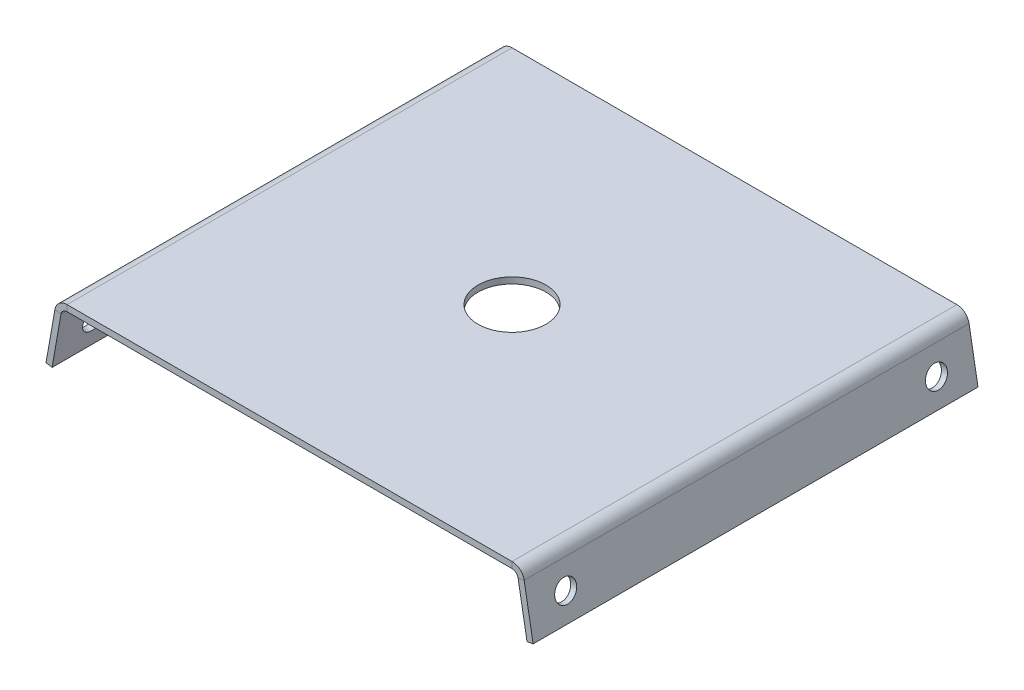
ISO-10303-21;
HEADER;
FILE_DESCRIPTION(('STEP AP214'),'2;1');
FILE_NAME('part.step','',(''),(''),'','','');
FILE_SCHEMA(('AUTOMOTIVE_DESIGN { 1 0 10303 214 1 1 1 1 }'));
ENDSEC;
DATA;
#1=APPLICATION_CONTEXT('core data for automotive mechanical design processes');
#2=APPLICATION_PROTOCOL_DEFINITION('international standard','automotive_design',2000,#1);
#3=PRODUCT_CONTEXT('',#1,'mechanical');
#4=PRODUCT('Part','Part','',(#3));
#5=PRODUCT_RELATED_PRODUCT_CATEGORY('part','',(#4));
#6=PRODUCT_DEFINITION_FORMATION('','',#4);
#7=PRODUCT_DEFINITION_CONTEXT('part definition',#1,'design');
#8=PRODUCT_DEFINITION('design','',#6,#7);
#9=PRODUCT_DEFINITION_SHAPE('','',#8);
#10=(LENGTH_UNIT() NAMED_UNIT(*) SI_UNIT(.MILLI.,.METRE.));
#11=(NAMED_UNIT(*) PLANE_ANGLE_UNIT() SI_UNIT($,.RADIAN.));
#12=(NAMED_UNIT(*) SI_UNIT($,.STERADIAN.) SOLID_ANGLE_UNIT());
#13=UNCERTAINTY_MEASURE_WITH_UNIT(LENGTH_MEASURE(1.E-05),#10,'distance_accuracy_value','');
#14=(GEOMETRIC_REPRESENTATION_CONTEXT(3) GLOBAL_UNCERTAINTY_ASSIGNED_CONTEXT((#13)) GLOBAL_UNIT_ASSIGNED_CONTEXT((#10,
#11,#12)) REPRESENTATION_CONTEXT('',''));
#15=CARTESIAN_POINT('',(0.,0.,0.));
#16=DIRECTION('',(0.,0.,1.));
#17=DIRECTION('',(1.,0.,0.));
#18=AXIS2_PLACEMENT_3D('',#15,#16,#17);
#19=CARTESIAN_POINT('',(-114.3,3.175,114.3));
#20=DIRECTION('',(0.,0.,-1.));
#21=DIRECTION('',(1.,0.,0.));
#22=AXIS2_PLACEMENT_3D('',#19,#20,#21);
#23=PLANE('',#22);
#24=DIRECTION('',(0.,1.,0.));
#25=VECTOR('',#24,1.);
#26=CARTESIAN_POINT('',(-114.3,3.175,114.3));
#27=LINE('',#26,#25);
#28=CARTESIAN_POINT('',(-114.3,0.,114.3));
#29=VERTEX_POINT('',#28);
#30=CARTESIAN_POINT('',(-114.3,3.175,114.3));
#31=VERTEX_POINT('',#30);
#32=EDGE_CURVE('E88',#29,#31,#27,.T.);
#33=ORIENTED_EDGE('',*,*,#32,.F.);
#34=DIRECTION('',(1.,0.,0.));
#35=VECTOR('',#34,1.);
#36=CARTESIAN_POINT('',(0.,0.,114.3));
#37=LINE('',#36,#35);
#38=CARTESIAN_POINT('',(114.3,0.,114.3));
#39=VERTEX_POINT('',#38);
#40=EDGE_CURVE('E281',#29,#39,#37,.T.);
#41=ORIENTED_EDGE('',*,*,#40,.T.);
#42=DIRECTION('',(0.,1.,0.));
#43=VECTOR('',#42,1.);
#44=CARTESIAN_POINT('',(114.3,3.175,114.3));
#45=LINE('',#44,#43);
#46=CARTESIAN_POINT('',(114.3,3.17500000000002,114.3));
#47=VERTEX_POINT('',#46);
#48=EDGE_CURVE('E290',#39,#47,#45,.T.);
#49=ORIENTED_EDGE('',*,*,#48,.T.);
#50=DIRECTION('',(1.,0.,0.));
#51=VECTOR('',#50,1.);
#52=CARTESIAN_POINT('',(-114.3,3.175,114.3));
#53=LINE('',#52,#51);
#54=EDGE_CURVE('E273',#31,#47,#53,.T.);
#55=ORIENTED_EDGE('',*,*,#54,.F.);
#56=EDGE_LOOP('',(#33,#41,#49,#55));
#57=FACE_BOUND('',#56,.T.);
#58=ADVANCED_FACE('F79',(#57),#23,.F.);
#59=CARTESIAN_POINT('',(-114.3,3.175,-114.3));
#60=DIRECTION('',(0.,0.,1.));
#61=DIRECTION('',(-1.,0.,0.));
#62=AXIS2_PLACEMENT_3D('',#59,#60,#61);
#63=PLANE('',#62);
#64=DIRECTION('',(1.,0.,0.));
#65=VECTOR('',#64,1.);
#66=CARTESIAN_POINT('',(0.,0.,-114.3));
#67=LINE('',#66,#65);
#68=CARTESIAN_POINT('',(114.3,0.,-114.3));
#69=VERTEX_POINT('',#68);
#70=CARTESIAN_POINT('',(-114.3,0.,-114.3));
#71=VERTEX_POINT('',#70);
#72=EDGE_CURVE('E280',#69,#71,#67,.F.);
#73=ORIENTED_EDGE('',*,*,#72,.T.);
#74=DIRECTION('',(0.,1.,0.));
#75=VECTOR('',#74,1.);
#76=CARTESIAN_POINT('',(-114.3,3.175,-114.3));
#77=LINE('',#76,#75);
#78=CARTESIAN_POINT('',(-114.3,3.17500000000002,-114.3));
#79=VERTEX_POINT('',#78);
#80=EDGE_CURVE('E13',#71,#79,#77,.T.);
#81=ORIENTED_EDGE('',*,*,#80,.T.);
#82=DIRECTION('',(-1.,0.,0.));
#83=VECTOR('',#82,1.);
#84=CARTESIAN_POINT('',(-114.3,3.175,-114.3));
#85=LINE('',#84,#83);
#86=CARTESIAN_POINT('',(114.3,3.175,-114.3));
#87=VERTEX_POINT('',#86);
#88=EDGE_CURVE('E266',#87,#79,#85,.T.);
#89=ORIENTED_EDGE('',*,*,#88,.F.);
#90=DIRECTION('',(0.,1.,0.));
#91=VECTOR('',#90,1.);
#92=CARTESIAN_POINT('',(114.3,3.175,-114.3));
#93=LINE('',#92,#91);
#94=EDGE_CURVE('E83',#69,#87,#93,.T.);
#95=ORIENTED_EDGE('',*,*,#94,.F.);
#96=EDGE_LOOP('',(#73,#81,#89,#95));
#97=FACE_BOUND('',#96,.T.);
#98=ADVANCED_FACE('F320',(#97),#63,.F.);
#99=CARTESIAN_POINT('',(0.,3.175,0.));
#100=DIRECTION('',(0.,-1.,0.));
#101=DIRECTION('',(0.,0.,-1.));
#102=AXIS2_PLACEMENT_3D('',#99,#100,#101);
#103=CYLINDRICAL_SURFACE('',#102,17.4625);
#104=CARTESIAN_POINT('',(0.,3.175,0.));
#105=DIRECTION('',(0.,1.,0.));
#106=DIRECTION('',(0.,0.,1.));
#107=AXIS2_PLACEMENT_3D('',#104,#105,#106);
#108=CIRCLE('',#107,17.4625);
#109=CARTESIAN_POINT('',(0.,3.175,17.4625));
#110=VERTEX_POINT('',#109);
#111=EDGE_CURVE('E276',#110,#110,#108,.T.);
#112=ORIENTED_EDGE('',*,*,#111,.T.);
#113=EDGE_LOOP('',(#112));
#114=FACE_BOUND('',#113,.T.);
#115=CARTESIAN_POINT('',(0.,0.,0.));
#116=DIRECTION('',(0.,1.,0.));
#117=DIRECTION('',(0.,0.,1.));
#118=AXIS2_PLACEMENT_3D('',#115,#116,#117);
#119=CIRCLE('',#118,17.4625);
#120=CARTESIAN_POINT('',(0.,0.,17.4625));
#121=VERTEX_POINT('',#120);
#122=EDGE_CURVE('E267',#121,#121,#119,.T.);
#123=ORIENTED_EDGE('',*,*,#122,.F.);
#124=EDGE_LOOP('',(#123));
#125=FACE_BOUND('',#124,.T.);
#126=ADVANCED_FACE('F81',(#114,#125),#103,.F.);
#127=CARTESIAN_POINT('',(0.,3.175,0.));
#128=DIRECTION('',(0.,-1.,0.));
#129=DIRECTION('',(0.,0.,-1.));
#130=AXIS2_PLACEMENT_3D('',#127,#128,#129);
#131=PLANE('',#130);
#132=DIRECTION('',(0.,0.,-1.));
#133=VECTOR('',#132,1.);
#134=CARTESIAN_POINT('',(114.3,3.175,114.3));
#135=LINE('',#134,#133);
#136=EDGE_CURVE('E263',#47,#87,#135,.T.);
#137=ORIENTED_EDGE('',*,*,#136,.T.);
#138=ORIENTED_EDGE('',*,*,#88,.T.);
#139=DIRECTION('',(0.,0.,1.));
#140=VECTOR('',#139,1.);
#141=CARTESIAN_POINT('',(-114.3,3.175,114.3));
#142=LINE('',#141,#140);
#143=EDGE_CURVE('E270',#79,#31,#142,.T.);
#144=ORIENTED_EDGE('',*,*,#143,.T.);
#145=ORIENTED_EDGE('',*,*,#54,.T.);
#146=EDGE_LOOP('',(#137,#138,#144,#145));
#147=FACE_BOUND('',#146,.T.);
#148=ORIENTED_EDGE('',*,*,#111,.F.);
#149=EDGE_LOOP('',(#148));
#150=FACE_BOUND('',#149,.T.);
#151=ADVANCED_FACE('F301',(#147,#150),#131,.F.);
#152=CARTESIAN_POINT('',(0.,0.,0.));
#153=DIRECTION('',(0.,-1.,0.));
#154=DIRECTION('',(0.,0.,-1.));
#155=AXIS2_PLACEMENT_3D('',#152,#153,#154);
#156=PLANE('',#155);
#157=DIRECTION('',(0.,0.,-1.));
#158=VECTOR('',#157,1.);
#159=CARTESIAN_POINT('',(114.3,0.,0.));
#160=LINE('',#159,#158);
#161=EDGE_CURVE('E254',#39,#69,#160,.T.);
#162=ORIENTED_EDGE('',*,*,#161,.F.);
#163=ORIENTED_EDGE('',*,*,#40,.F.);
#164=DIRECTION('',(0.,0.,-1.));
#165=VECTOR('',#164,1.);
#166=CARTESIAN_POINT('',(-114.3,0.,0.));
#167=LINE('',#166,#165);
#168=EDGE_CURVE('E284',#71,#29,#167,.F.);
#169=ORIENTED_EDGE('',*,*,#168,.F.);
#170=ORIENTED_EDGE('',*,*,#72,.F.);
#171=EDGE_LOOP('',(#162,#163,#169,#170));
#172=FACE_BOUND('',#171,.T.);
#173=ORIENTED_EDGE('',*,*,#122,.T.);
#174=EDGE_LOOP('',(#173));
#175=FACE_BOUND('',#174,.T.);
#176=ADVANCED_FACE('F315',(#172,#175),#156,.T.);
#177=CARTESIAN_POINT('',(114.3,-3.17500000000001,-114.3));
#178=DIRECTION('',(0.,0.,-1.));
#179=DIRECTION('',(-1.,0.,0.));
#180=AXIS2_PLACEMENT_3D('',#177,#178,#179);
#181=PLANE('',#180);
#182=DIRECTION('',(-0.984807753012208,-0.173648177666934,0.));
#183=VECTOR('',#182,1.);
#184=CARTESIAN_POINT('',(120.553529231628,-2.07233407181498,-114.3));
#185=LINE('',#184,#183);
#186=CARTESIAN_POINT('',(117.426764615814,-2.62366703590749,-114.3));
#187=VERTEX_POINT('',#186);
#188=CARTESIAN_POINT('',(120.553529231628,-2.07233407181498,-114.3));
#189=VERTEX_POINT('',#188);
#190=EDGE_CURVE('E213',#187,#189,#185,.F.);
#191=ORIENTED_EDGE('',*,*,#190,.F.);
#192=CARTESIAN_POINT('',(114.3,-3.17500000000001,-114.3));
#193=DIRECTION('',(0.,0.,1.));
#194=DIRECTION('',(1.,0.,0.));
#195=AXIS2_PLACEMENT_3D('',#192,#193,#194);
#196=CIRCLE('',#195,3.17500000000003);
#197=EDGE_CURVE('E258',#69,#187,#196,.F.);
#198=ORIENTED_EDGE('',*,*,#197,.F.);
#199=ORIENTED_EDGE('',*,*,#94,.T.);
#200=CARTESIAN_POINT('',(114.3,-3.17500000000001,-114.3));
#201=DIRECTION('',(0.,0.,1.));
#202=DIRECTION('',(1.,0.,0.));
#203=AXIS2_PLACEMENT_3D('',#200,#201,#202);
#204=CIRCLE('',#203,6.35000000000003);
#205=EDGE_CURVE('E103',#87,#189,#204,.F.);
#206=ORIENTED_EDGE('',*,*,#205,.T.);
#207=EDGE_LOOP('',(#191,#198,#199,#206));
#208=FACE_BOUND('',#207,.T.);
#209=ADVANCED_FACE('F322',(#208),#181,.T.);
#210=CARTESIAN_POINT('',(114.3,-3.17500000000001,114.3));
#211=DIRECTION('',(0.,0.,-1.));
#212=DIRECTION('',(-1.,0.,0.));
#213=AXIS2_PLACEMENT_3D('',#210,#211,#212);
#214=PLANE('',#213);
#215=CARTESIAN_POINT('',(114.3,-3.17500000000001,114.3));
#216=DIRECTION('',(0.,0.,1.));
#217=DIRECTION('',(1.,0.,0.));
#218=AXIS2_PLACEMENT_3D('',#215,#216,#217);
#219=CIRCLE('',#218,3.17500000000003);
#220=CARTESIAN_POINT('',(117.426764615814,-2.62366703590749,114.3));
#221=VERTEX_POINT('',#220);
#222=EDGE_CURVE('E226',#221,#39,#219,.T.);
#223=ORIENTED_EDGE('',*,*,#222,.F.);
#224=DIRECTION('',(-0.984807753012208,-0.173648177666934,0.));
#225=VECTOR('',#224,1.);
#226=CARTESIAN_POINT('',(117.426764615814,-2.6236670359075,114.3));
#227=LINE('',#226,#225);
#228=CARTESIAN_POINT('',(120.553529231628,-2.07233407181498,114.3));
#229=VERTEX_POINT('',#228);
#230=EDGE_CURVE('E246',#221,#229,#227,.F.);
#231=ORIENTED_EDGE('',*,*,#230,.T.);
#232=CARTESIAN_POINT('',(114.3,-3.17500000000001,114.3));
#233=DIRECTION('',(0.,0.,1.));
#234=DIRECTION('',(1.,0.,0.));
#235=AXIS2_PLACEMENT_3D('',#232,#233,#234);
#236=CIRCLE('',#235,6.35000000000003);
#237=EDGE_CURVE('E255',#229,#47,#236,.T.);
#238=ORIENTED_EDGE('',*,*,#237,.T.);
#239=ORIENTED_EDGE('',*,*,#48,.F.);
#240=EDGE_LOOP('',(#223,#231,#238,#239));
#241=FACE_BOUND('',#240,.T.);
#242=ADVANCED_FACE('F306',(#241),#214,.F.);
#243=CARTESIAN_POINT('',(114.3,-3.17500000000001,114.3));
#244=DIRECTION('',(0.,0.,1.));
#245=DIRECTION('',(0.984807753012208,0.173648177666934,0.));
#246=AXIS2_PLACEMENT_3D('',#243,#244,#245);
#247=CYLINDRICAL_SURFACE('',#246,6.35000000000003);
#248=ORIENTED_EDGE('',*,*,#136,.F.);
#249=ORIENTED_EDGE('',*,*,#237,.F.);
#250=DIRECTION('',(0.,0.,1.));
#251=VECTOR('',#250,1.);
#252=CARTESIAN_POINT('',(120.553529231628,-2.07233407181497,-114.3));
#253=LINE('',#252,#251);
#254=EDGE_CURVE('E244',#229,#189,#253,.F.);
#255=ORIENTED_EDGE('',*,*,#254,.T.);
#256=ORIENTED_EDGE('',*,*,#205,.F.);
#257=EDGE_LOOP('',(#248,#249,#255,#256));
#258=FACE_BOUND('',#257,.T.);
#259=ADVANCED_FACE('F323',(#258),#247,.T.);
#260=CARTESIAN_POINT('',(114.3,-3.17500000000001,114.3));
#261=DIRECTION('',(0.,0.,1.));
#262=DIRECTION('',(0.984807753012208,0.173648177666934,0.));
#263=AXIS2_PLACEMENT_3D('',#260,#261,#262);
#264=CYLINDRICAL_SURFACE('',#263,3.17500000000003);
#265=ORIENTED_EDGE('',*,*,#161,.T.);
#266=ORIENTED_EDGE('',*,*,#197,.T.);
#267=DIRECTION('',(0.,0.,1.));
#268=VECTOR('',#267,1.);
#269=CARTESIAN_POINT('',(117.426764615814,-2.6236670359075,-114.3));
#270=LINE('',#269,#268);
#271=EDGE_CURVE('E249',#187,#221,#270,.T.);
#272=ORIENTED_EDGE('',*,*,#271,.T.);
#273=ORIENTED_EDGE('',*,*,#222,.T.);
#274=EDGE_LOOP('',(#265,#266,#272,#273));
#275=FACE_BOUND('',#274,.T.);
#276=ADVANCED_FACE('F310',(#275),#264,.F.);
#277=CARTESIAN_POINT('',(125.141612298901,-28.0926461581376,114.3));
#278=DIRECTION('',(0.,0.,-1.));
#279=DIRECTION('',(-1.,0.,0.));
#280=AXIS2_PLACEMENT_3D('',#277,#278,#279);
#281=PLANE('',#280);
#282=ORIENTED_EDGE('',*,*,#230,.F.);
#283=DIRECTION('',(-0.173648177666934,0.984807753012207,0.));
#284=VECTOR('',#283,1.);
#285=CARTESIAN_POINT('',(122.014847683087,-28.6439791222301,114.3));
#286=LINE('',#285,#284);
#287=CARTESIAN_POINT('',(122.014847683087,-28.6439791222301,114.3));
#288=VERTEX_POINT('',#287);
#289=EDGE_CURVE('E242',#221,#288,#286,.F.);
#290=ORIENTED_EDGE('',*,*,#289,.T.);
#291=DIRECTION('',(-0.984807753012208,-0.173648177666934,0.));
#292=VECTOR('',#291,1.);
#293=CARTESIAN_POINT('',(125.141612298901,-28.0926461581376,114.3));
#294=LINE('',#293,#292);
#295=CARTESIAN_POINT('',(125.141612298901,-28.0926461581376,114.3));
#296=VERTEX_POINT('',#295);
#297=EDGE_CURVE('E223',#296,#288,#294,.T.);
#298=ORIENTED_EDGE('',*,*,#297,.F.);
#299=DIRECTION('',(0.173648177666934,-0.984807753012207,0.));
#300=VECTOR('',#299,1.);
#301=CARTESIAN_POINT('',(116.644339222716,20.0977841551549,114.3));
#302=LINE('',#301,#300);
#303=EDGE_CURVE('E235',#229,#296,#302,.T.);
#304=ORIENTED_EDGE('',*,*,#303,.F.);
#305=EDGE_LOOP('',(#282,#290,#298,#304));
#306=FACE_BOUND('',#305,.T.);
#307=ADVANCED_FACE('F333',(#306),#281,.F.);
#308=CARTESIAN_POINT('',(120.090905944802,0.551332964092513,-114.3));
#309=DIRECTION('',(0.,0.,1.));
#310=DIRECTION('',(1.,0.,0.));
#311=AXIS2_PLACEMENT_3D('',#308,#309,#310);
#312=PLANE('',#311);
#313=ORIENTED_EDGE('',*,*,#190,.T.);
#314=DIRECTION('',(-0.173648177666934,0.984807753012207,0.));
#315=VECTOR('',#314,1.);
#316=CARTESIAN_POINT('',(116.644339222716,20.0977841551549,-114.3));
#317=LINE('',#316,#315);
#318=CARTESIAN_POINT('',(125.141612298901,-28.0926461581376,-114.3));
#319=VERTEX_POINT('',#318);
#320=EDGE_CURVE('E230',#319,#189,#317,.T.);
#321=ORIENTED_EDGE('',*,*,#320,.F.);
#322=DIRECTION('',(-0.984807753012208,-0.173648177666934,0.));
#323=VECTOR('',#322,1.);
#324=CARTESIAN_POINT('',(125.141612298901,-28.0926461581376,-114.3));
#325=LINE('',#324,#323);
#326=CARTESIAN_POINT('',(122.014847683087,-28.6439791222301,-114.3));
#327=VERTEX_POINT('',#326);
#328=EDGE_CURVE('E227',#319,#327,#325,.T.);
#329=ORIENTED_EDGE('',*,*,#328,.T.);
#330=DIRECTION('',(0.173648177666934,-0.984807753012207,0.));
#331=VECTOR('',#330,1.);
#332=CARTESIAN_POINT('',(116.964141328988,0.,-114.3));
#333=LINE('',#332,#331);
#334=EDGE_CURVE('E237',#327,#187,#333,.F.);
#335=ORIENTED_EDGE('',*,*,#334,.T.);
#336=EDGE_LOOP('',(#313,#321,#329,#335));
#337=FACE_BOUND('',#336,.T.);
#338=ADVANCED_FACE('F340',(#337),#312,.F.);
#339=CARTESIAN_POINT('',(116.644339222716,20.0977841551549,0.));
#340=DIRECTION('',(-0.984807753012208,-0.173648177666934,0.));
#341=DIRECTION('',(0.173648177666934,-0.984807753012208,0.));
#342=AXIS2_PLACEMENT_3D('',#339,#340,#341);
#343=PLANE('',#342);
#344=CARTESIAN_POINT('',(122.847570765264,-15.0824901149763,95.25));
#345=DIRECTION('',(0.984807753012207,0.173648177666934,0.));
#346=DIRECTION('',(-0.173648177666934,0.984807753012207,0.));
#347=AXIS2_PLACEMENT_3D('',#344,#345,#346);
#348=CIRCLE('',#347,5.58799999999999);
#349=CARTESIAN_POINT('',(121.877224748461,-9.57938439114406,95.25));
#350=VERTEX_POINT('',#349);
#351=EDGE_CURVE('E500',#350,#350,#348,.T.);
#352=ORIENTED_EDGE('',*,*,#351,.F.);
#353=EDGE_LOOP('',(#352));
#354=FACE_BOUND('',#353,.T.);
#355=CARTESIAN_POINT('',(122.847570765264,-15.0824901149763,-95.25));
#356=DIRECTION('',(0.984807753012207,0.173648177666934,0.));
#357=DIRECTION('',(-0.173648177666934,0.984807753012207,0.));
#358=AXIS2_PLACEMENT_3D('',#355,#356,#357);
#359=CIRCLE('',#358,5.58799999999999);
#360=CARTESIAN_POINT('',(121.877224748461,-9.57938439114406,-95.25));
#361=VERTEX_POINT('',#360);
#362=EDGE_CURVE('E493',#361,#361,#359,.T.);
#363=ORIENTED_EDGE('',*,*,#362,.F.);
#364=EDGE_LOOP('',(#363));
#365=FACE_BOUND('',#364,.T.);
#366=ORIENTED_EDGE('',*,*,#254,.F.);
#367=ORIENTED_EDGE('',*,*,#303,.T.);
#368=DIRECTION('',(0.,0.,-1.));
#369=VECTOR('',#368,1.);
#370=CARTESIAN_POINT('',(125.141612298901,-28.0926461581376,0.));
#371=LINE('',#370,#369);
#372=EDGE_CURVE('E233',#296,#319,#371,.T.);
#373=ORIENTED_EDGE('',*,*,#372,.T.);
#374=ORIENTED_EDGE('',*,*,#320,.T.);
#375=EDGE_LOOP('',(#366,#367,#373,#374));
#376=FACE_BOUND('',#375,.T.);
#377=ADVANCED_FACE('F329',(#354,#365,#376),#343,.F.);
#378=CARTESIAN_POINT('',(113.517574606902,19.5464511910624,0.));
#379=DIRECTION('',(-0.984807753012208,-0.173648177666934,0.));
#380=DIRECTION('',(0.173648177666934,-0.984807753012208,0.));
#381=AXIS2_PLACEMENT_3D('',#378,#379,#380);
#382=PLANE('',#381);
#383=CARTESIAN_POINT('',(119.720806149451,-15.6338230790688,95.25));
#384=DIRECTION('',(0.984807753012207,0.173648177666934,0.));
#385=DIRECTION('',(-0.173648177666934,0.984807753012207,0.));
#386=AXIS2_PLACEMENT_3D('',#383,#384,#385);
#387=CIRCLE('',#386,5.58799999999999);
#388=CARTESIAN_POINT('',(118.750460132648,-10.1307173552366,95.25));
#389=VERTEX_POINT('',#388);
#390=EDGE_CURVE('E211',#389,#389,#387,.T.);
#391=ORIENTED_EDGE('',*,*,#390,.T.);
#392=EDGE_LOOP('',(#391));
#393=FACE_BOUND('',#392,.T.);
#394=CARTESIAN_POINT('',(119.720806149451,-15.6338230790688,-95.25));
#395=DIRECTION('',(0.984807753012207,0.173648177666934,0.));
#396=DIRECTION('',(-0.173648177666934,0.984807753012207,0.));
#397=AXIS2_PLACEMENT_3D('',#394,#395,#396);
#398=CIRCLE('',#397,5.58799999999999);
#399=CARTESIAN_POINT('',(118.750460132648,-10.1307173552366,-95.25));
#400=VERTEX_POINT('',#399);
#401=EDGE_CURVE('E496',#400,#400,#398,.T.);
#402=ORIENTED_EDGE('',*,*,#401,.T.);
#403=EDGE_LOOP('',(#402));
#404=FACE_BOUND('',#403,.T.);
#405=ORIENTED_EDGE('',*,*,#289,.F.);
#406=ORIENTED_EDGE('',*,*,#271,.F.);
#407=ORIENTED_EDGE('',*,*,#334,.F.);
#408=DIRECTION('',(0.,0.,1.));
#409=VECTOR('',#408,1.);
#410=CARTESIAN_POINT('',(122.014847683087,-28.6439791222301,-114.3));
#411=LINE('',#410,#409);
#412=EDGE_CURVE('E240',#288,#327,#411,.F.);
#413=ORIENTED_EDGE('',*,*,#412,.F.);
#414=EDGE_LOOP('',(#405,#406,#407,#413));
#415=FACE_BOUND('',#414,.T.);
#416=ADVANCED_FACE('F342',(#393,#404,#415),#382,.T.);
#417=CARTESIAN_POINT('',(125.141612298901,-28.0926461581376,-114.3));
#418=DIRECTION('',(-0.173648177666934,0.984807753012207,0.));
#419=DIRECTION('',(-0.984807753012207,-0.173648177666934,0.));
#420=AXIS2_PLACEMENT_3D('',#417,#418,#419);
#421=PLANE('',#420);
#422=ORIENTED_EDGE('',*,*,#412,.T.);
#423=ORIENTED_EDGE('',*,*,#328,.F.);
#424=ORIENTED_EDGE('',*,*,#372,.F.);
#425=ORIENTED_EDGE('',*,*,#297,.T.);
#426=EDGE_LOOP('',(#422,#423,#424,#425));
#427=FACE_BOUND('',#426,.T.);
#428=ADVANCED_FACE('F336',(#427),#421,.F.);
#429=CARTESIAN_POINT('',(-114.3,-3.17500000000001,114.3));
#430=DIRECTION('',(0.,0.,1.));
#431=DIRECTION('',(1.,0.,0.));
#432=AXIS2_PLACEMENT_3D('',#429,#430,#431);
#433=PLANE('',#432);
#434=DIRECTION('',(0.984807753012208,-0.173648177666934,0.));
#435=VECTOR('',#434,1.);
#436=CARTESIAN_POINT('',(-120.553529231628,-2.07233407181498,114.3));
#437=LINE('',#436,#435);
#438=CARTESIAN_POINT('',(-117.426764615814,-2.62366703590749,114.3));
#439=VERTEX_POINT('',#438);
#440=CARTESIAN_POINT('',(-120.553529231628,-2.07233407181498,114.3));
#441=VERTEX_POINT('',#440);
#442=EDGE_CURVE('E193',#439,#441,#437,.F.);
#443=ORIENTED_EDGE('',*,*,#442,.F.);
#444=CARTESIAN_POINT('',(-114.3,-3.17500000000001,114.3));
#445=DIRECTION('',(0.,0.,-1.));
#446=DIRECTION('',(-1.,0.,0.));
#447=AXIS2_PLACEMENT_3D('',#444,#445,#446);
#448=CIRCLE('',#447,3.17500000000003);
#449=EDGE_CURVE('E217',#29,#439,#448,.F.);
#450=ORIENTED_EDGE('',*,*,#449,.F.);
#451=ORIENTED_EDGE('',*,*,#32,.T.);
#452=CARTESIAN_POINT('',(-114.3,-3.17500000000001,114.3));
#453=DIRECTION('',(0.,0.,-1.));
#454=DIRECTION('',(-1.,0.,0.));
#455=AXIS2_PLACEMENT_3D('',#452,#453,#454);
#456=CIRCLE('',#455,6.35000000000003);
#457=EDGE_CURVE('E95',#31,#441,#456,.F.);
#458=ORIENTED_EDGE('',*,*,#457,.T.);
#459=EDGE_LOOP('',(#443,#450,#451,#458));
#460=FACE_BOUND('',#459,.T.);
#461=ADVANCED_FACE('F296',(#460),#433,.T.);
#462=CARTESIAN_POINT('',(-114.3,-3.17500000000001,-114.3));
#463=DIRECTION('',(0.,0.,1.));
#464=DIRECTION('',(1.,0.,0.));
#465=AXIS2_PLACEMENT_3D('',#462,#463,#464);
#466=PLANE('',#465);
#467=CARTESIAN_POINT('',(-114.3,-3.17500000000001,-114.3));
#468=DIRECTION('',(0.,0.,-1.));
#469=DIRECTION('',(-1.,0.,0.));
#470=AXIS2_PLACEMENT_3D('',#467,#468,#469);
#471=CIRCLE('',#470,3.17500000000003);
#472=CARTESIAN_POINT('',(-117.426764615814,-2.62366703590749,-114.3));
#473=VERTEX_POINT('',#472);
#474=EDGE_CURVE('E220',#473,#71,#471,.T.);
#475=ORIENTED_EDGE('',*,*,#474,.F.);
#476=DIRECTION('',(0.984807753012208,-0.173648177666934,0.));
#477=VECTOR('',#476,1.);
#478=CARTESIAN_POINT('',(-117.426764615814,-2.6236670359075,-114.3));
#479=LINE('',#478,#477);
#480=CARTESIAN_POINT('',(-120.553529231628,-2.07233407181498,-114.3));
#481=VERTEX_POINT('',#480);
#482=EDGE_CURVE('E205',#473,#481,#479,.F.);
#483=ORIENTED_EDGE('',*,*,#482,.T.);
#484=CARTESIAN_POINT('',(-114.3,-3.17500000000001,-114.3));
#485=DIRECTION('',(0.,0.,-1.));
#486=DIRECTION('',(-1.,0.,0.));
#487=AXIS2_PLACEMENT_3D('',#484,#485,#486);
#488=CIRCLE('',#487,6.35000000000003);
#489=EDGE_CURVE('E214',#481,#79,#488,.T.);
#490=ORIENTED_EDGE('',*,*,#489,.T.);
#491=ORIENTED_EDGE('',*,*,#80,.F.);
#492=EDGE_LOOP('',(#475,#483,#490,#491));
#493=FACE_BOUND('',#492,.T.);
#494=ADVANCED_FACE('F477',(#493),#466,.F.);
#495=CARTESIAN_POINT('',(-114.3,-3.17500000000001,-114.3));
#496=DIRECTION('',(0.,0.,-1.));
#497=DIRECTION('',(-0.984807753012208,0.173648177666934,0.));
#498=AXIS2_PLACEMENT_3D('',#495,#496,#497);
#499=CYLINDRICAL_SURFACE('',#498,6.35000000000003);
#500=ORIENTED_EDGE('',*,*,#143,.F.);
#501=ORIENTED_EDGE('',*,*,#489,.F.);
#502=DIRECTION('',(0.,0.,-1.));
#503=VECTOR('',#502,1.);
#504=CARTESIAN_POINT('',(-120.553529231628,-2.07233407181497,114.3));
#505=LINE('',#504,#503);
#506=EDGE_CURVE('E203',#481,#441,#505,.F.);
#507=ORIENTED_EDGE('',*,*,#506,.T.);
#508=ORIENTED_EDGE('',*,*,#457,.F.);
#509=EDGE_LOOP('',(#500,#501,#507,#508));
#510=FACE_BOUND('',#509,.T.);
#511=ADVANCED_FACE('F474',(#510),#499,.T.);
#512=CARTESIAN_POINT('',(-114.3,-3.17500000000001,-114.3));
#513=DIRECTION('',(0.,0.,-1.));
#514=DIRECTION('',(-0.984807753012208,0.173648177666934,0.));
#515=AXIS2_PLACEMENT_3D('',#512,#513,#514);
#516=CYLINDRICAL_SURFACE('',#515,3.17500000000003);
#517=ORIENTED_EDGE('',*,*,#168,.T.);
#518=ORIENTED_EDGE('',*,*,#449,.T.);
#519=DIRECTION('',(0.,0.,-1.));
#520=VECTOR('',#519,1.);
#521=CARTESIAN_POINT('',(-117.426764615814,-2.6236670359075,114.3));
#522=LINE('',#521,#520);
#523=EDGE_CURVE('E208',#439,#473,#522,.T.);
#524=ORIENTED_EDGE('',*,*,#523,.T.);
#525=ORIENTED_EDGE('',*,*,#474,.T.);
#526=EDGE_LOOP('',(#517,#518,#524,#525));
#527=FACE_BOUND('',#526,.T.);
#528=ADVANCED_FACE('F472',(#527),#516,.F.);
#529=CARTESIAN_POINT('',(-125.141612298901,-28.0926461581376,-114.3));
#530=DIRECTION('',(0.,0.,1.));
#531=DIRECTION('',(1.,0.,0.));
#532=AXIS2_PLACEMENT_3D('',#529,#530,#531);
#533=PLANE('',#532);
#534=ORIENTED_EDGE('',*,*,#482,.F.);
#535=DIRECTION('',(0.173648177666934,0.984807753012207,0.));
#536=VECTOR('',#535,1.);
#537=CARTESIAN_POINT('',(-122.014847683087,-28.6439791222301,-114.3));
#538=LINE('',#537,#536);
#539=CARTESIAN_POINT('',(-122.014847683087,-28.6439791222301,-114.3));
#540=VERTEX_POINT('',#539);
#541=EDGE_CURVE('E201',#473,#540,#538,.F.);
#542=ORIENTED_EDGE('',*,*,#541,.T.);
#543=DIRECTION('',(0.984807753012208,-0.173648177666934,0.));
#544=VECTOR('',#543,1.);
#545=CARTESIAN_POINT('',(-125.141612298901,-28.0926461581376,-114.3));
#546=LINE('',#545,#544);
#547=CARTESIAN_POINT('',(-125.141612298901,-28.0926461581376,-114.3));
#548=VERTEX_POINT('',#547);
#549=EDGE_CURVE('E189',#548,#540,#546,.T.);
#550=ORIENTED_EDGE('',*,*,#549,.F.);
#551=DIRECTION('',(-0.173648177666934,-0.984807753012207,0.));
#552=VECTOR('',#551,1.);
#553=CARTESIAN_POINT('',(-116.644339222716,20.0977841551549,-114.3));
#554=LINE('',#553,#552);
#555=EDGE_CURVE('E176',#481,#548,#554,.T.);
#556=ORIENTED_EDGE('',*,*,#555,.F.);
#557=EDGE_LOOP('',(#534,#542,#550,#556));
#558=FACE_BOUND('',#557,.T.);
#559=ADVANCED_FACE('F468',(#558),#533,.F.);
#560=CARTESIAN_POINT('',(-120.090905944802,0.551332964092513,114.3));
#561=DIRECTION('',(0.,0.,-1.));
#562=DIRECTION('',(-1.,0.,0.));
#563=AXIS2_PLACEMENT_3D('',#560,#561,#562);
#564=PLANE('',#563);
#565=ORIENTED_EDGE('',*,*,#442,.T.);
#566=DIRECTION('',(0.173648177666934,0.984807753012207,0.));
#567=VECTOR('',#566,1.);
#568=CARTESIAN_POINT('',(-116.644339222716,20.0977841551549,114.3));
#569=LINE('',#568,#567);
#570=CARTESIAN_POINT('',(-125.141612298901,-28.0926461581376,114.3));
#571=VERTEX_POINT('',#570);
#572=EDGE_CURVE('E174',#571,#441,#569,.T.);
#573=ORIENTED_EDGE('',*,*,#572,.F.);
#574=DIRECTION('',(0.984807753012208,-0.173648177666934,0.));
#575=VECTOR('',#574,1.);
#576=CARTESIAN_POINT('',(-125.141612298901,-28.0926461581376,114.3));
#577=LINE('',#576,#575);
#578=CARTESIAN_POINT('',(-122.014847683087,-28.6439791222301,114.3));
#579=VERTEX_POINT('',#578);
#580=EDGE_CURVE('E182',#571,#579,#577,.T.);
#581=ORIENTED_EDGE('',*,*,#580,.T.);
#582=DIRECTION('',(-0.173648177666934,-0.984807753012207,0.));
#583=VECTOR('',#582,1.);
#584=CARTESIAN_POINT('',(-116.964141328988,0.,114.3));
#585=LINE('',#584,#583);
#586=EDGE_CURVE('E198',#579,#439,#585,.F.);
#587=ORIENTED_EDGE('',*,*,#586,.T.);
#588=EDGE_LOOP('',(#565,#573,#581,#587));
#589=FACE_BOUND('',#588,.T.);
#590=ADVANCED_FACE('F192',(#589),#564,.F.);
#591=CARTESIAN_POINT('',(-116.644339222716,20.0977841551549,0.));
#592=DIRECTION('',(0.984807753012208,-0.173648177666934,0.));
#593=DIRECTION('',(0.173648177666934,0.984807753012208,0.));
#594=AXIS2_PLACEMENT_3D('',#591,#592,#593);
#595=PLANE('',#594);
#596=CARTESIAN_POINT('',(-122.847570765264,-15.0824901149763,95.25));
#597=DIRECTION('',(0.984807753012207,-0.173648177666934,0.));
#598=DIRECTION('',(0.173648177666934,0.984807753012207,0.));
#599=AXIS2_PLACEMENT_3D('',#596,#597,#598);
#600=CIRCLE('',#599,5.58799999999999);
#601=CARTESIAN_POINT('',(-121.877224748461,-9.57938439114406,95.25));
#602=VERTEX_POINT('',#601);
#603=EDGE_CURVE('E510',#602,#602,#600,.T.);
#604=ORIENTED_EDGE('',*,*,#603,.T.);
#605=EDGE_LOOP('',(#604));
#606=FACE_BOUND('',#605,.T.);
#607=CARTESIAN_POINT('',(-122.847570765264,-15.0824901149763,-95.25));
#608=DIRECTION('',(0.984807753012207,-0.173648177666934,0.));
#609=DIRECTION('',(0.173648177666934,0.984807753012207,0.));
#610=AXIS2_PLACEMENT_3D('',#607,#608,#609);
#611=CIRCLE('',#610,5.58799999999999);
#612=CARTESIAN_POINT('',(-121.877224748461,-9.57938439114406,-95.25));
#613=VERTEX_POINT('',#612);
#614=EDGE_CURVE('E504',#613,#613,#611,.T.);
#615=ORIENTED_EDGE('',*,*,#614,.T.);
#616=EDGE_LOOP('',(#615));
#617=FACE_BOUND('',#616,.T.);
#618=ORIENTED_EDGE('',*,*,#506,.F.);
#619=ORIENTED_EDGE('',*,*,#555,.T.);
#620=DIRECTION('',(0.,0.,1.));
#621=VECTOR('',#620,1.);
#622=CARTESIAN_POINT('',(-125.141612298901,-28.0926461581376,0.));
#623=LINE('',#622,#621);
#624=EDGE_CURVE('E169',#548,#571,#623,.T.);
#625=ORIENTED_EDGE('',*,*,#624,.T.);
#626=ORIENTED_EDGE('',*,*,#572,.T.);
#627=EDGE_LOOP('',(#618,#619,#625,#626));
#628=FACE_BOUND('',#627,.T.);
#629=ADVANCED_FACE('F172',(#606,#617,#628),#595,.F.);
#630=CARTESIAN_POINT('',(-113.517574606902,19.5464511910624,0.));
#631=DIRECTION('',(0.984807753012208,-0.173648177666934,0.));
#632=DIRECTION('',(0.173648177666934,0.984807753012208,0.));
#633=AXIS2_PLACEMENT_3D('',#630,#631,#632);
#634=PLANE('',#633);
#635=CARTESIAN_POINT('',(-119.720806149451,-15.6338230790688,95.25));
#636=DIRECTION('',(0.984807753012207,-0.173648177666934,0.));
#637=DIRECTION('',(0.173648177666934,0.984807753012207,0.));
#638=AXIS2_PLACEMENT_3D('',#635,#636,#637);
#639=CIRCLE('',#638,5.58799999999999);
#640=CARTESIAN_POINT('',(-118.750460132648,-10.1307173552366,95.25));
#641=VERTEX_POINT('',#640);
#642=EDGE_CURVE('E497',#641,#641,#639,.T.);
#643=ORIENTED_EDGE('',*,*,#642,.F.);
#644=EDGE_LOOP('',(#643));
#645=FACE_BOUND('',#644,.T.);
#646=CARTESIAN_POINT('',(-119.720806149451,-15.6338230790688,-95.25));
#647=DIRECTION('',(0.984807753012207,-0.173648177666934,0.));
#648=DIRECTION('',(0.173648177666934,0.984807753012207,0.));
#649=AXIS2_PLACEMENT_3D('',#646,#647,#648);
#650=CIRCLE('',#649,5.58799999999999);
#651=CARTESIAN_POINT('',(-118.750460132648,-10.1307173552366,-95.25));
#652=VERTEX_POINT('',#651);
#653=EDGE_CURVE('E507',#652,#652,#650,.T.);
#654=ORIENTED_EDGE('',*,*,#653,.F.);
#655=EDGE_LOOP('',(#654));
#656=FACE_BOUND('',#655,.T.);
#657=ORIENTED_EDGE('',*,*,#541,.F.);
#658=ORIENTED_EDGE('',*,*,#523,.F.);
#659=ORIENTED_EDGE('',*,*,#586,.F.);
#660=DIRECTION('',(0.,0.,-1.));
#661=VECTOR('',#660,1.);
#662=CARTESIAN_POINT('',(-122.014847683087,-28.6439791222301,114.3));
#663=LINE('',#662,#661);
#664=EDGE_CURVE('E185',#540,#579,#663,.F.);
#665=ORIENTED_EDGE('',*,*,#664,.F.);
#666=EDGE_LOOP('',(#657,#658,#659,#665));
#667=FACE_BOUND('',#666,.T.);
#668=ADVANCED_FACE('F429',(#645,#656,#667),#634,.T.);
#669=CARTESIAN_POINT('',(-125.141612298901,-28.0926461581376,114.3));
#670=DIRECTION('',(0.173648177666934,0.984807753012207,0.));
#671=DIRECTION('',(-0.984807753012207,0.173648177666934,0.));
#672=AXIS2_PLACEMENT_3D('',#669,#670,#671);
#673=PLANE('',#672);
#674=ORIENTED_EDGE('',*,*,#664,.T.);
#675=ORIENTED_EDGE('',*,*,#580,.F.);
#676=ORIENTED_EDGE('',*,*,#624,.F.);
#677=ORIENTED_EDGE('',*,*,#549,.T.);
#678=EDGE_LOOP('',(#674,#675,#676,#677));
#679=FACE_BOUND('',#678,.T.);
#680=ADVANCED_FACE('F183',(#679),#673,.F.);
#681=CARTESIAN_POINT('',(119.720806149451,-15.6338230790688,-95.25));
#682=DIRECTION('',(0.984807753012207,0.173648177666934,0.));
#683=DIRECTION('',(-0.173648177666934,0.984807753012207,0.));
#684=AXIS2_PLACEMENT_3D('',#681,#682,#683);
#685=CYLINDRICAL_SURFACE('',#684,5.58799999999999);
#686=ORIENTED_EDGE('',*,*,#401,.F.);
#687=EDGE_LOOP('',(#686));
#688=FACE_BOUND('',#687,.T.);
#689=ORIENTED_EDGE('',*,*,#362,.T.);
#690=EDGE_LOOP('',(#689));
#691=FACE_BOUND('',#690,.T.);
#692=ADVANCED_FACE('F402',(#688,#691),#685,.F.);
#693=CARTESIAN_POINT('',(119.720806149451,-15.6338230790688,95.25));
#694=DIRECTION('',(0.984807753012207,0.173648177666934,0.));
#695=DIRECTION('',(-0.173648177666934,0.984807753012207,0.));
#696=AXIS2_PLACEMENT_3D('',#693,#694,#695);
#697=CYLINDRICAL_SURFACE('',#696,5.58799999999999);
#698=ORIENTED_EDGE('',*,*,#390,.F.);
#699=EDGE_LOOP('',(#698));
#700=FACE_BOUND('',#699,.T.);
#701=ORIENTED_EDGE('',*,*,#351,.T.);
#702=EDGE_LOOP('',(#701));
#703=FACE_BOUND('',#702,.T.);
#704=ADVANCED_FACE('F407',(#700,#703),#697,.F.);
#705=CARTESIAN_POINT('',(-119.720806149451,-15.6338230790688,-95.25));
#706=DIRECTION('',(-0.984807753012207,0.173648177666934,0.));
#707=DIRECTION('',(-0.173648177666934,-0.984807753012207,0.));
#708=AXIS2_PLACEMENT_3D('',#705,#706,#707);
#709=CYLINDRICAL_SURFACE('',#708,5.58799999999999);
#710=ORIENTED_EDGE('',*,*,#653,.T.);
#711=EDGE_LOOP('',(#710));
#712=FACE_BOUND('',#711,.T.);
#713=ORIENTED_EDGE('',*,*,#614,.F.);
#714=EDGE_LOOP('',(#713));
#715=FACE_BOUND('',#714,.T.);
#716=ADVANCED_FACE('F417',(#712,#715),#709,.F.);
#717=CARTESIAN_POINT('',(-119.720806149451,-15.6338230790688,95.25));
#718=DIRECTION('',(-0.984807753012207,0.173648177666934,0.));
#719=DIRECTION('',(-0.173648177666934,-0.984807753012207,0.));
#720=AXIS2_PLACEMENT_3D('',#717,#718,#719);
#721=CYLINDRICAL_SURFACE('',#720,5.58799999999999);
#722=ORIENTED_EDGE('',*,*,#642,.T.);
#723=EDGE_LOOP('',(#722));
#724=FACE_BOUND('',#723,.T.);
#725=ORIENTED_EDGE('',*,*,#603,.F.);
#726=EDGE_LOOP('',(#725));
#727=FACE_BOUND('',#726,.T.);
#728=ADVANCED_FACE('F450',(#724,#727),#721,.F.);
#729=CLOSED_SHELL('',(#58,#98,#126,#151,#176,#209,#242,#259,#276,#307,#338,#377,#416,#428,#461,
#494,#511,#528,#559,#590,#629,#668,#680,#692,#704,#716,#728));
#730=MANIFOLD_SOLID_BREP('B2',#729);
#731=ADVANCED_BREP_SHAPE_REPRESENTATION('',(#18,#730),#14);
#732=SHAPE_DEFINITION_REPRESENTATION(#9,#731);
ENDSEC;
END-ISO-10303-21;
